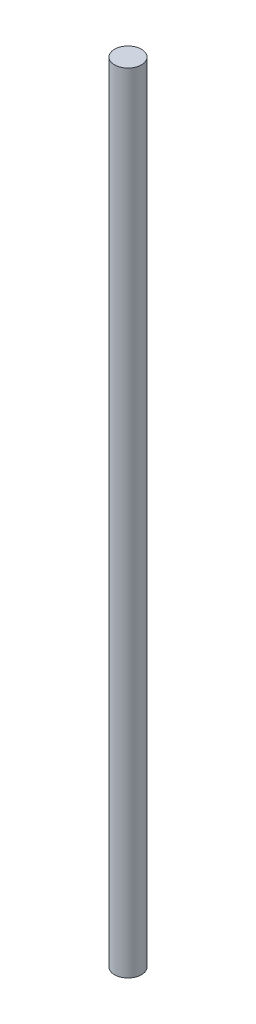
ISO-10303-21;
HEADER;
FILE_DESCRIPTION(('STEP AP214'),'2;1');
FILE_NAME('part.step','',(''),(''),'','','');
FILE_SCHEMA(('AUTOMOTIVE_DESIGN { 1 0 10303 214 1 1 1 1 }'));
ENDSEC;
DATA;
#1=APPLICATION_CONTEXT('core data for automotive mechanical design processes');
#2=APPLICATION_PROTOCOL_DEFINITION('international standard','automotive_design',2000,#1);
#3=PRODUCT_CONTEXT('',#1,'mechanical');
#4=PRODUCT('Part','Part','',(#3));
#5=PRODUCT_RELATED_PRODUCT_CATEGORY('part','',(#4));
#6=PRODUCT_DEFINITION_FORMATION('','',#4);
#7=PRODUCT_DEFINITION_CONTEXT('part definition',#1,'design');
#8=PRODUCT_DEFINITION('design','',#6,#7);
#9=PRODUCT_DEFINITION_SHAPE('','',#8);
#10=(LENGTH_UNIT() NAMED_UNIT(*) SI_UNIT(.MILLI.,.METRE.));
#11=(NAMED_UNIT(*) PLANE_ANGLE_UNIT() SI_UNIT($,.RADIAN.));
#12=(NAMED_UNIT(*) SI_UNIT($,.STERADIAN.) SOLID_ANGLE_UNIT());
#13=UNCERTAINTY_MEASURE_WITH_UNIT(LENGTH_MEASURE(1.E-05),#10,'distance_accuracy_value','');
#14=(GEOMETRIC_REPRESENTATION_CONTEXT(3) GLOBAL_UNCERTAINTY_ASSIGNED_CONTEXT((#13)) GLOBAL_UNIT_ASSIGNED_CONTEXT((#10,
#11,#12)) REPRESENTATION_CONTEXT('',''));
#15=CARTESIAN_POINT('',(0.,0.,0.));
#16=DIRECTION('',(0.,0.,1.));
#17=DIRECTION('',(1.,0.,0.));
#18=AXIS2_PLACEMENT_3D('',#15,#16,#17);
#19=CARTESIAN_POINT('',(0.,350.,0.));
#20=DIRECTION('',(0.,-1.,0.));
#21=DIRECTION('',(0.,0.,-1.));
#22=AXIS2_PLACEMENT_3D('',#19,#20,#21);
#23=CYLINDRICAL_SURFACE('',#22,6.);
#24=CARTESIAN_POINT('',(0.,350.,0.));
#25=DIRECTION('',(0.,1.,0.));
#26=DIRECTION('',(0.,0.,1.));
#27=AXIS2_PLACEMENT_3D('',#24,#25,#26);
#28=CIRCLE('',#27,6.);
#29=CARTESIAN_POINT('',(0.,350.,6.));
#30=VERTEX_POINT('',#29);
#31=EDGE_CURVE('E10',#30,#30,#28,.T.);
#32=ORIENTED_EDGE('',*,*,#31,.F.);
#33=EDGE_LOOP('',(#32));
#34=FACE_BOUND('',#33,.T.);
#35=CARTESIAN_POINT('',(0.,0.,0.));
#36=DIRECTION('',(0.,1.,0.));
#37=DIRECTION('',(0.,0.,1.));
#38=AXIS2_PLACEMENT_3D('',#35,#36,#37);
#39=CIRCLE('',#38,6.);
#40=CARTESIAN_POINT('',(0.,0.,6.));
#41=VERTEX_POINT('',#40);
#42=EDGE_CURVE('E40',#41,#41,#39,.T.);
#43=ORIENTED_EDGE('',*,*,#42,.T.);
#44=EDGE_LOOP('',(#43));
#45=FACE_BOUND('',#44,.T.);
#46=ADVANCED_FACE('F37',(#34,#45),#23,.T.);
#47=CARTESIAN_POINT('',(0.,350.,0.));
#48=DIRECTION('',(0.,1.,0.));
#49=DIRECTION('',(0.,0.,1.));
#50=AXIS2_PLACEMENT_3D('',#47,#48,#49);
#51=PLANE('',#50);
#52=ORIENTED_EDGE('',*,*,#31,.T.);
#53=EDGE_LOOP('',(#52));
#54=FACE_BOUND('',#53,.T.);
#55=ADVANCED_FACE('F54',(#54),#51,.T.);
#56=CARTESIAN_POINT('',(0.,0.,0.));
#57=DIRECTION('',(0.,1.,0.));
#58=DIRECTION('',(0.,0.,1.));
#59=AXIS2_PLACEMENT_3D('',#56,#57,#58);
#60=PLANE('',#59);
#61=ORIENTED_EDGE('',*,*,#42,.F.);
#62=EDGE_LOOP('',(#61));
#63=FACE_BOUND('',#62,.T.);
#64=ADVANCED_FACE('F52',(#63),#60,.F.);
#65=CLOSED_SHELL('',(#46,#55,#64));
#66=MANIFOLD_SOLID_BREP('B2',#65);
#67=ADVANCED_BREP_SHAPE_REPRESENTATION('',(#18,#66),#14);
#68=SHAPE_DEFINITION_REPRESENTATION(#9,#67);
ENDSEC;
END-ISO-10303-21;
